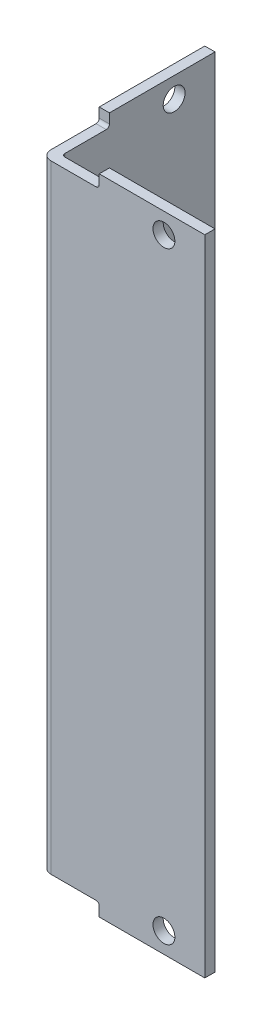
ISO-10303-21;
HEADER;
FILE_DESCRIPTION(('STEP AP214'),'2;1');
FILE_NAME('part.step','',(''),(''),'','','');
FILE_SCHEMA(('AUTOMOTIVE_DESIGN { 1 0 10303 214 1 1 1 1 }'));
ENDSEC;
DATA;
#1=APPLICATION_CONTEXT('core data for automotive mechanical design processes');
#2=APPLICATION_PROTOCOL_DEFINITION('international standard','automotive_design',2000,#1);
#3=PRODUCT_CONTEXT('',#1,'mechanical');
#4=PRODUCT('Part','Part','',(#3));
#5=PRODUCT_RELATED_PRODUCT_CATEGORY('part','',(#4));
#6=PRODUCT_DEFINITION_FORMATION('','',#4);
#7=PRODUCT_DEFINITION_CONTEXT('part definition',#1,'design');
#8=PRODUCT_DEFINITION('design','',#6,#7);
#9=PRODUCT_DEFINITION_SHAPE('','',#8);
#10=(LENGTH_UNIT() NAMED_UNIT(*) SI_UNIT(.MILLI.,.METRE.));
#11=(NAMED_UNIT(*) PLANE_ANGLE_UNIT() SI_UNIT($,.RADIAN.));
#12=(NAMED_UNIT(*) SI_UNIT($,.STERADIAN.) SOLID_ANGLE_UNIT());
#13=UNCERTAINTY_MEASURE_WITH_UNIT(LENGTH_MEASURE(1.E-05),#10,'distance_accuracy_value','');
#14=(GEOMETRIC_REPRESENTATION_CONTEXT(3) GLOBAL_UNCERTAINTY_ASSIGNED_CONTEXT((#13)) GLOBAL_UNIT_ASSIGNED_CONTEXT((#10,
#11,#12)) REPRESENTATION_CONTEXT('',''));
#15=CARTESIAN_POINT('',(0.,0.,0.));
#16=DIRECTION('',(0.,0.,1.));
#17=DIRECTION('',(1.,0.,0.));
#18=AXIS2_PLACEMENT_3D('',#15,#16,#17);
#19=CARTESIAN_POINT('',(-10.6045,-56.75,10.6045));
#20=DIRECTION('',(0.,-1.,0.));
#21=DIRECTION('',(0.,0.,-1.));
#22=AXIS2_PLACEMENT_3D('',#19,#20,#21);
#23=CYLINDRICAL_SURFACE('',#22,0.508);
#24=CARTESIAN_POINT('',(-10.6045,48.250000046,10.6045));
#25=DIRECTION('',(0.,1.,0.));
#26=DIRECTION('',(0.,0.,1.));
#27=AXIS2_PLACEMENT_3D('',#24,#25,#26);
#28=CIRCLE('',#27,0.508);
#29=CARTESIAN_POINT('',(-10.6045,48.250000046,11.1125));
#30=VERTEX_POINT('',#29);
#31=CARTESIAN_POINT('',(-11.1125,48.250000046,10.6045));
#32=VERTEX_POINT('',#31);
#33=EDGE_CURVE('E499',#30,#32,#28,.F.);
#34=ORIENTED_EDGE('',*,*,#33,.F.);
#35=DIRECTION('',(0.,1.,0.));
#36=VECTOR('',#35,1.);
#37=CARTESIAN_POINT('',(-10.6045,56.75,11.1125));
#38=LINE('',#37,#36);
#39=CARTESIAN_POINT('',(-10.6045,-47.75,11.1125));
#40=VERTEX_POINT('',#39);
#41=EDGE_CURVE('E350',#40,#30,#38,.T.);
#42=ORIENTED_EDGE('',*,*,#41,.F.);
#43=CARTESIAN_POINT('',(-10.6045,-47.75,10.6045));
#44=DIRECTION('',(0.,-1.,0.));
#45=DIRECTION('',(0.,0.,-1.));
#46=AXIS2_PLACEMENT_3D('',#43,#44,#45);
#47=CIRCLE('',#46,0.508);
#48=CARTESIAN_POINT('',(-11.1125,-47.75,10.6045));
#49=VERTEX_POINT('',#48);
#50=EDGE_CURVE('E535',#49,#40,#47,.F.);
#51=ORIENTED_EDGE('',*,*,#50,.F.);
#52=DIRECTION('',(0.,1.,0.));
#53=VECTOR('',#52,1.);
#54=CARTESIAN_POINT('',(-11.1125,-56.75,10.6045));
#55=LINE('',#54,#53);
#56=EDGE_CURVE('E354',#32,#49,#55,.F.);
#57=ORIENTED_EDGE('',*,*,#56,.F.);
#58=EDGE_LOOP('',(#34,#42,#51,#57));
#59=FACE_BOUND('',#58,.T.);
#60=ADVANCED_FACE('F44',(#59),#23,.F.);
#61=CARTESIAN_POINT('',(-11.2,56.75,11.2));
#62=DIRECTION('',(0.,-1.,0.));
#63=DIRECTION('',(0.,0.,-1.));
#64=AXIS2_PLACEMENT_3D('',#61,#62,#63);
#65=CYLINDRICAL_SURFACE('',#64,1.5);
#66=DIRECTION('',(0.,-1.,0.));
#67=VECTOR('',#66,1.);
#68=CARTESIAN_POINT('',(-11.2,56.75,12.7));
#69=LINE('',#68,#67);
#70=CARTESIAN_POINT('',(-11.2,48.250000046,12.7));
#71=VERTEX_POINT('',#70);
#72=CARTESIAN_POINT('',(-11.2,-47.75,12.7));
#73=VERTEX_POINT('',#72);
#74=EDGE_CURVE('E357',#71,#73,#69,.T.);
#75=ORIENTED_EDGE('',*,*,#74,.F.);
#76=CARTESIAN_POINT('',(-11.2,48.250000046,11.2));
#77=DIRECTION('',(0.,1.,0.));
#78=DIRECTION('',(0.,0.,1.));
#79=AXIS2_PLACEMENT_3D('',#76,#77,#78);
#80=CIRCLE('',#79,1.5);
#81=CARTESIAN_POINT('',(-12.7,48.250000046,11.2));
#82=VERTEX_POINT('',#81);
#83=EDGE_CURVE('E487',#71,#82,#80,.F.);
#84=ORIENTED_EDGE('',*,*,#83,.T.);
#85=DIRECTION('',(0.,-1.,0.));
#86=VECTOR('',#85,1.);
#87=CARTESIAN_POINT('',(-12.7,56.75,11.2));
#88=LINE('',#87,#86);
#89=CARTESIAN_POINT('',(-12.7,-47.75,11.2));
#90=VERTEX_POINT('',#89);
#91=EDGE_CURVE('E363',#90,#82,#88,.F.);
#92=ORIENTED_EDGE('',*,*,#91,.F.);
#93=CARTESIAN_POINT('',(-11.2,-47.75,11.2));
#94=DIRECTION('',(0.,-1.,0.));
#95=DIRECTION('',(0.,0.,-1.));
#96=AXIS2_PLACEMENT_3D('',#93,#94,#95);
#97=CIRCLE('',#96,1.5);
#98=EDGE_CURVE('E423',#90,#73,#97,.F.);
#99=ORIENTED_EDGE('',*,*,#98,.T.);
#100=EDGE_LOOP('',(#75,#84,#92,#99));
#101=FACE_BOUND('',#100,.T.);
#102=ADVANCED_FACE('F621',(#101),#65,.T.);
#103=CARTESIAN_POINT('',(-12.7,56.75,12.7));
#104=DIRECTION('',(1.,0.,0.));
#105=DIRECTION('',(0.,0.,-1.));
#106=AXIS2_PLACEMENT_3D('',#103,#104,#105);
#107=PLANE('',#106);
#108=CARTESIAN_POINT('',(-12.7,-46.575,-6.35));
#109=DIRECTION('',(-1.,0.,0.));
#110=DIRECTION('',(0.,0.,1.));
#111=AXIS2_PLACEMENT_3D('',#108,#109,#110);
#112=CIRCLE('',#111,1.69999999999999);
#113=CARTESIAN_POINT('',(-12.7,-46.575,-4.65));
#114=VERTEX_POINT('',#113);
#115=EDGE_CURVE('E301',#114,#114,#112,.T.);
#116=ORIENTED_EDGE('',*,*,#115,.F.);
#117=EDGE_LOOP('',(#116));
#118=FACE_BOUND('',#117,.T.);
#119=CARTESIAN_POINT('',(-12.7,47.075,-6.35));
#120=DIRECTION('',(-1.,0.,0.));
#121=DIRECTION('',(0.,0.,1.));
#122=AXIS2_PLACEMENT_3D('',#119,#120,#121);
#123=CIRCLE('',#122,1.69999999999999);
#124=CARTESIAN_POINT('',(-12.7,47.075,-4.65));
#125=VERTEX_POINT('',#124);
#126=EDGE_CURVE('E321',#125,#125,#123,.T.);
#127=ORIENTED_EDGE('',*,*,#126,.F.);
#128=EDGE_LOOP('',(#127));
#129=FACE_BOUND('',#128,.T.);
#130=DIRECTION('',(0.,0.,1.));
#131=VECTOR('',#130,1.);
#132=CARTESIAN_POINT('',(-12.7,-33.749999954,9.1125));
#133=LINE('',#132,#131);
#134=CARTESIAN_POINT('',(-12.7,-33.749999954,4.2));
#135=VERTEX_POINT('',#134);
#136=CARTESIAN_POINT('',(-12.7,-33.749999954,7.525));
#137=VERTEX_POINT('',#136);
#138=EDGE_CURVE('E546',#135,#137,#133,.T.);
#139=ORIENTED_EDGE('',*,*,#138,.T.);
#140=CARTESIAN_POINT('',(-12.7,-35.337499954,7.525));
#141=DIRECTION('',(1.,0.,0.));
#142=DIRECTION('',(0.,0.,-1.));
#143=AXIS2_PLACEMENT_3D('',#140,#141,#142);
#144=CIRCLE('',#143,1.5875);
#145=CARTESIAN_POINT('',(-12.7,-35.337499954,9.1125));
#146=VERTEX_POINT('',#145);
#147=EDGE_CURVE('E416',#137,#146,#144,.T.);
#148=ORIENTED_EDGE('',*,*,#147,.T.);
#149=DIRECTION('',(0.,-1.,0.));
#150=VECTOR('',#149,1.);
#151=CARTESIAN_POINT('',(-12.7,-40.749999954,9.1125));
#152=LINE('',#151,#150);
#153=CARTESIAN_POINT('',(-12.7,-39.162499954,9.1125));
#154=VERTEX_POINT('',#153);
#155=EDGE_CURVE('E550',#146,#154,#152,.T.);
#156=ORIENTED_EDGE('',*,*,#155,.T.);
#157=CARTESIAN_POINT('',(-12.7,-39.162499954,7.525));
#158=DIRECTION('',(1.,0.,0.));
#159=DIRECTION('',(0.,0.,-1.));
#160=AXIS2_PLACEMENT_3D('',#157,#158,#159);
#161=CIRCLE('',#160,1.5875);
#162=CARTESIAN_POINT('',(-12.7,-40.749999954,7.525));
#163=VERTEX_POINT('',#162);
#164=EDGE_CURVE('E410',#154,#163,#161,.T.);
#165=ORIENTED_EDGE('',*,*,#164,.T.);
#166=DIRECTION('',(0.,0.,1.));
#167=VECTOR('',#166,1.);
#168=CARTESIAN_POINT('',(-12.7,-40.749999954,9.1125));
#169=LINE('',#168,#167);
#170=CARTESIAN_POINT('',(-12.7,-40.749999954,4.2));
#171=VERTEX_POINT('',#170);
#172=EDGE_CURVE('E554',#171,#163,#169,.T.);
#173=ORIENTED_EDGE('',*,*,#172,.F.);
#174=CARTESIAN_POINT('',(-12.7,-39.162499954,4.2));
#175=DIRECTION('',(1.,0.,0.));
#176=DIRECTION('',(0.,0.,-1.));
#177=AXIS2_PLACEMENT_3D('',#174,#175,#176);
#178=CIRCLE('',#177,1.5875);
#179=CARTESIAN_POINT('',(-12.7,-39.162499954,2.6125));
#180=VERTEX_POINT('',#179);
#181=EDGE_CURVE('E404',#171,#180,#178,.T.);
#182=ORIENTED_EDGE('',*,*,#181,.T.);
#183=DIRECTION('',(0.,-1.,0.));
#184=VECTOR('',#183,1.);
#185=CARTESIAN_POINT('',(-12.7,-40.749999954,2.6125));
#186=LINE('',#185,#184);
#187=CARTESIAN_POINT('',(-12.7,-35.337499954,2.6125));
#188=VERTEX_POINT('',#187);
#189=EDGE_CURVE('E574',#188,#180,#186,.T.);
#190=ORIENTED_EDGE('',*,*,#189,.F.);
#191=CARTESIAN_POINT('',(-12.7,-35.337499954,4.2));
#192=DIRECTION('',(1.,0.,0.));
#193=DIRECTION('',(0.,0.,-1.));
#194=AXIS2_PLACEMENT_3D('',#191,#192,#193);
#195=CIRCLE('',#194,1.5875);
#196=EDGE_CURVE('E398',#188,#135,#195,.T.);
#197=ORIENTED_EDGE('',*,*,#196,.T.);
#198=EDGE_LOOP('',(#139,#148,#156,#165,#173,#182,#190,#197));
#199=FACE_BOUND('',#198,.T.);
#200=DIRECTION('',(0.,0.,-1.));
#201=VECTOR('',#200,1.);
#202=CARTESIAN_POINT('',(-12.7,48.250000046,12.7));
#203=LINE('',#202,#201);
#204=CARTESIAN_POINT('',(-12.7,48.250000046,4.2));
#205=VERTEX_POINT('',#204);
#206=EDGE_CURVE('E280',#82,#205,#203,.T.);
#207=ORIENTED_EDGE('',*,*,#206,.T.);
#208=CARTESIAN_POINT('',(-12.7,48.750000046,4.2));
#209=DIRECTION('',(1.,0.,0.));
#210=DIRECTION('',(0.,0.,-1.));
#211=AXIS2_PLACEMENT_3D('',#208,#209,#210);
#212=CIRCLE('',#211,0.5);
#213=CARTESIAN_POINT('',(-12.7,48.750000046,3.7));
#214=VERTEX_POINT('',#213);
#215=EDGE_CURVE('E264',#205,#214,#212,.T.);
#216=ORIENTED_EDGE('',*,*,#215,.T.);
#217=DIRECTION('',(0.,1.,0.));
#218=VECTOR('',#217,1.);
#219=CARTESIAN_POINT('',(-12.7,48.250000046,3.7));
#220=LINE('',#219,#218);
#221=CARTESIAN_POINT('',(-12.7,50.250000046,3.7));
#222=VERTEX_POINT('',#221);
#223=EDGE_CURVE('E255',#214,#222,#220,.T.);
#224=ORIENTED_EDGE('',*,*,#223,.T.);
#225=DIRECTION('',(0.,0.,1.));
#226=VECTOR('',#225,1.);
#227=CARTESIAN_POINT('',(-12.7,50.250000046,-12.7));
#228=LINE('',#227,#226);
#229=CARTESIAN_POINT('',(-12.7,50.250000046,-12.7));
#230=VERTEX_POINT('',#229);
#231=EDGE_CURVE('E261',#230,#222,#228,.T.);
#232=ORIENTED_EDGE('',*,*,#231,.F.);
#233=DIRECTION('',(0.,-1.,0.));
#234=VECTOR('',#233,1.);
#235=CARTESIAN_POINT('',(-12.7,56.75,-12.7));
#236=LINE('',#235,#234);
#237=CARTESIAN_POINT('',(-12.7,-49.75,-12.7));
#238=VERTEX_POINT('',#237);
#239=EDGE_CURVE('E347',#230,#238,#236,.T.);
#240=ORIENTED_EDGE('',*,*,#239,.T.);
#241=DIRECTION('',(0.,0.,-1.));
#242=VECTOR('',#241,1.);
#243=CARTESIAN_POINT('',(-12.7,-49.75,-12.7));
#244=LINE('',#243,#242);
#245=CARTESIAN_POINT('',(-12.7,-49.75,3.7));
#246=VERTEX_POINT('',#245);
#247=EDGE_CURVE('E293',#246,#238,#244,.T.);
#248=ORIENTED_EDGE('',*,*,#247,.F.);
#249=DIRECTION('',(0.,-1.,0.));
#250=VECTOR('',#249,1.);
#251=CARTESIAN_POINT('',(-12.7,-47.75,3.7));
#252=LINE('',#251,#250);
#253=CARTESIAN_POINT('',(-12.7,-48.25,3.7));
#254=VERTEX_POINT('',#253);
#255=EDGE_CURVE('E519',#254,#246,#252,.T.);
#256=ORIENTED_EDGE('',*,*,#255,.F.);
#257=CARTESIAN_POINT('',(-12.7,-48.25,4.2));
#258=DIRECTION('',(1.,0.,0.));
#259=DIRECTION('',(0.,0.,-1.));
#260=AXIS2_PLACEMENT_3D('',#257,#258,#259);
#261=CIRCLE('',#260,0.5);
#262=CARTESIAN_POINT('',(-12.7,-47.75,4.2));
#263=VERTEX_POINT('',#262);
#264=EDGE_CURVE('E444',#254,#263,#261,.T.);
#265=ORIENTED_EDGE('',*,*,#264,.T.);
#266=DIRECTION('',(0.,0.,-1.));
#267=VECTOR('',#266,1.);
#268=CARTESIAN_POINT('',(-12.7,-47.75,12.7));
#269=LINE('',#268,#267);
#270=EDGE_CURVE('E511',#90,#263,#269,.T.);
#271=ORIENTED_EDGE('',*,*,#270,.F.);
#272=ORIENTED_EDGE('',*,*,#91,.T.);
#273=EDGE_LOOP('',(#207,#216,#224,#232,#240,#248,#256,#265,#271,#272));
#274=FACE_BOUND('',#273,.T.);
#275=ADVANCED_FACE('F258',(#118,#129,#199,#274),#107,.F.);
#276=CARTESIAN_POINT('',(-11.1125,-56.75,-12.7));
#277=DIRECTION('',(-1.,0.,0.));
#278=DIRECTION('',(0.,0.,1.));
#279=AXIS2_PLACEMENT_3D('',#276,#277,#278);
#280=PLANE('',#279);
#281=CARTESIAN_POINT('',(-11.1125,-46.575,-6.35));
#282=DIRECTION('',(-1.,0.,0.));
#283=DIRECTION('',(0.,0.,1.));
#284=AXIS2_PLACEMENT_3D('',#281,#282,#283);
#285=CIRCLE('',#284,1.69999999999999);
#286=CARTESIAN_POINT('',(-11.1125,-46.575,-4.65));
#287=VERTEX_POINT('',#286);
#288=EDGE_CURVE('E312',#287,#287,#285,.T.);
#289=ORIENTED_EDGE('',*,*,#288,.T.);
#290=EDGE_LOOP('',(#289));
#291=FACE_BOUND('',#290,.T.);
#292=CARTESIAN_POINT('',(-11.1125,47.075,-6.35));
#293=DIRECTION('',(-1.,0.,0.));
#294=DIRECTION('',(0.,0.,1.));
#295=AXIS2_PLACEMENT_3D('',#292,#293,#294);
#296=CIRCLE('',#295,1.69999999999999);
#297=CARTESIAN_POINT('',(-11.1125,47.075,-4.65));
#298=VERTEX_POINT('',#297);
#299=EDGE_CURVE('E325',#298,#298,#296,.T.);
#300=ORIENTED_EDGE('',*,*,#299,.T.);
#301=EDGE_LOOP('',(#300));
#302=FACE_BOUND('',#301,.T.);
#303=DIRECTION('',(0.,1.,0.));
#304=VECTOR('',#303,1.);
#305=CARTESIAN_POINT('',(-11.1125,-40.749999954,2.6125));
#306=LINE('',#305,#304);
#307=CARTESIAN_POINT('',(-11.1125,-39.162499954,2.6125));
#308=VERTEX_POINT('',#307);
#309=CARTESIAN_POINT('',(-11.1125,-35.337499954,2.6125));
#310=VERTEX_POINT('',#309);
#311=EDGE_CURVE('E570',#308,#310,#306,.T.);
#312=ORIENTED_EDGE('',*,*,#311,.F.);
#313=CARTESIAN_POINT('',(-11.1125,-39.162499954,4.2));
#314=DIRECTION('',(-1.,0.,0.));
#315=DIRECTION('',(0.,0.,1.));
#316=AXIS2_PLACEMENT_3D('',#313,#314,#315);
#317=CIRCLE('',#316,1.5875);
#318=CARTESIAN_POINT('',(-11.1125,-40.749999954,4.2));
#319=VERTEX_POINT('',#318);
#320=EDGE_CURVE('E401',#308,#319,#317,.T.);
#321=ORIENTED_EDGE('',*,*,#320,.T.);
#322=DIRECTION('',(0.,0.,-1.));
#323=VECTOR('',#322,1.);
#324=CARTESIAN_POINT('',(-11.1125,-40.749999954,9.1125));
#325=LINE('',#324,#323);
#326=CARTESIAN_POINT('',(-11.1125,-40.749999954,7.525));
#327=VERTEX_POINT('',#326);
#328=EDGE_CURVE('E558',#327,#319,#325,.T.);
#329=ORIENTED_EDGE('',*,*,#328,.F.);
#330=CARTESIAN_POINT('',(-11.1125,-39.162499954,7.525));
#331=DIRECTION('',(-1.,0.,0.));
#332=DIRECTION('',(0.,0.,1.));
#333=AXIS2_PLACEMENT_3D('',#330,#331,#332);
#334=CIRCLE('',#333,1.5875);
#335=CARTESIAN_POINT('',(-11.1125,-39.162499954,9.1125));
#336=VERTEX_POINT('',#335);
#337=EDGE_CURVE('E407',#327,#336,#334,.T.);
#338=ORIENTED_EDGE('',*,*,#337,.T.);
#339=DIRECTION('',(0.,1.,0.));
#340=VECTOR('',#339,1.);
#341=CARTESIAN_POINT('',(-11.1125,-40.749999954,9.1125));
#342=LINE('',#341,#340);
#343=CARTESIAN_POINT('',(-11.1125,-35.337499954,9.1125));
#344=VERTEX_POINT('',#343);
#345=EDGE_CURVE('E562',#336,#344,#342,.T.);
#346=ORIENTED_EDGE('',*,*,#345,.T.);
#347=CARTESIAN_POINT('',(-11.1125,-35.337499954,7.525));
#348=DIRECTION('',(-1.,0.,0.));
#349=DIRECTION('',(0.,0.,1.));
#350=AXIS2_PLACEMENT_3D('',#347,#348,#349);
#351=CIRCLE('',#350,1.5875);
#352=CARTESIAN_POINT('',(-11.1125,-33.749999954,7.525));
#353=VERTEX_POINT('',#352);
#354=EDGE_CURVE('E413',#344,#353,#351,.T.);
#355=ORIENTED_EDGE('',*,*,#354,.T.);
#356=DIRECTION('',(0.,0.,-1.));
#357=VECTOR('',#356,1.);
#358=CARTESIAN_POINT('',(-11.1125,-33.749999954,9.1125));
#359=LINE('',#358,#357);
#360=CARTESIAN_POINT('',(-11.1125,-33.749999954,4.2));
#361=VERTEX_POINT('',#360);
#362=EDGE_CURVE('E566',#353,#361,#359,.T.);
#363=ORIENTED_EDGE('',*,*,#362,.T.);
#364=CARTESIAN_POINT('',(-11.1125,-35.337499954,4.2));
#365=DIRECTION('',(-1.,0.,0.));
#366=DIRECTION('',(0.,0.,1.));
#367=AXIS2_PLACEMENT_3D('',#364,#365,#366);
#368=CIRCLE('',#367,1.5875);
#369=EDGE_CURVE('E395',#361,#310,#368,.T.);
#370=ORIENTED_EDGE('',*,*,#369,.T.);
#371=EDGE_LOOP('',(#312,#321,#329,#338,#346,#355,#363,#370));
#372=FACE_BOUND('',#371,.T.);
#373=DIRECTION('',(0.,1.,0.));
#374=VECTOR('',#373,1.);
#375=CARTESIAN_POINT('',(-11.1125,-56.75,3.7));
#376=LINE('',#375,#374);
#377=CARTESIAN_POINT('',(-11.1125,48.750000046,3.7));
#378=VERTEX_POINT('',#377);
#379=CARTESIAN_POINT('',(-11.1125,50.250000046,3.7));
#380=VERTEX_POINT('',#379);
#381=EDGE_CURVE('E276',#378,#380,#376,.T.);
#382=ORIENTED_EDGE('',*,*,#381,.F.);
#383=CARTESIAN_POINT('',(-11.1125,48.750000046,4.2));
#384=DIRECTION('',(-1.,0.,0.));
#385=DIRECTION('',(0.,0.,1.));
#386=AXIS2_PLACEMENT_3D('',#383,#384,#385);
#387=CIRCLE('',#386,0.5);
#388=CARTESIAN_POINT('',(-11.1125,48.250000046,4.2));
#389=VERTEX_POINT('',#388);
#390=EDGE_CURVE('E471',#378,#389,#387,.T.);
#391=ORIENTED_EDGE('',*,*,#390,.T.);
#392=DIRECTION('',(0.,0.,-1.));
#393=VECTOR('',#392,1.);
#394=CARTESIAN_POINT('',(-11.1125,48.250000046,-12.7));
#395=LINE('',#394,#393);
#396=EDGE_CURVE('E505',#32,#389,#395,.T.);
#397=ORIENTED_EDGE('',*,*,#396,.F.);
#398=ORIENTED_EDGE('',*,*,#56,.T.);
#399=DIRECTION('',(0.,0.,1.));
#400=VECTOR('',#399,1.);
#401=CARTESIAN_POINT('',(-11.1125,-47.75,-12.7));
#402=LINE('',#401,#400);
#403=CARTESIAN_POINT('',(-11.1125,-47.75,4.2));
#404=VERTEX_POINT('',#403);
#405=EDGE_CURVE('E542',#404,#49,#402,.T.);
#406=ORIENTED_EDGE('',*,*,#405,.F.);
#407=CARTESIAN_POINT('',(-11.1125,-48.25,4.2));
#408=DIRECTION('',(-1.,0.,0.));
#409=DIRECTION('',(0.,0.,1.));
#410=AXIS2_PLACEMENT_3D('',#407,#408,#409);
#411=CIRCLE('',#410,0.5);
#412=CARTESIAN_POINT('',(-11.1125,-48.25,3.7));
#413=VERTEX_POINT('',#412);
#414=EDGE_CURVE('E441',#404,#413,#411,.T.);
#415=ORIENTED_EDGE('',*,*,#414,.T.);
#416=DIRECTION('',(0.,-1.,0.));
#417=VECTOR('',#416,1.);
#418=CARTESIAN_POINT('',(-11.1125,-56.75,3.7));
#419=LINE('',#418,#417);
#420=CARTESIAN_POINT('',(-11.1125,-49.75,3.7));
#421=VERTEX_POINT('',#420);
#422=EDGE_CURVE('E526',#413,#421,#419,.T.);
#423=ORIENTED_EDGE('',*,*,#422,.T.);
#424=DIRECTION('',(0.,0.,1.));
#425=VECTOR('',#424,1.);
#426=CARTESIAN_POINT('',(-11.1125,-49.75,-12.7));
#427=LINE('',#426,#425);
#428=CARTESIAN_POINT('',(-11.1125,-49.75,-12.7));
#429=VERTEX_POINT('',#428);
#430=EDGE_CURVE('E302',#429,#421,#427,.T.);
#431=ORIENTED_EDGE('',*,*,#430,.F.);
#432=DIRECTION('',(0.,1.,0.));
#433=VECTOR('',#432,1.);
#434=CARTESIAN_POINT('',(-11.1125,-56.75,-12.7));
#435=LINE('',#434,#433);
#436=CARTESIAN_POINT('',(-11.1125,50.250000046,-12.7));
#437=VERTEX_POINT('',#436);
#438=EDGE_CURVE('E337',#429,#437,#435,.T.);
#439=ORIENTED_EDGE('',*,*,#438,.T.);
#440=DIRECTION('',(0.,0.,-1.));
#441=VECTOR('',#440,1.);
#442=CARTESIAN_POINT('',(-11.1125,50.250000046,-12.7));
#443=LINE('',#442,#441);
#444=EDGE_CURVE('E290',#380,#437,#443,.T.);
#445=ORIENTED_EDGE('',*,*,#444,.F.);
#446=EDGE_LOOP('',(#382,#391,#397,#398,#406,#415,#423,#431,#439,#445));
#447=FACE_BOUND('',#446,.T.);
#448=ADVANCED_FACE('F634',(#291,#302,#372,#447),#280,.F.);
#449=CARTESIAN_POINT('',(-12.7,56.75,12.7));
#450=DIRECTION('',(0.,0.,-1.));
#451=DIRECTION('',(-1.,0.,0.));
#452=AXIS2_PLACEMENT_3D('',#449,#450,#451);
#453=PLANE('',#452);
#454=CARTESIAN_POINT('',(6.34999999999999,47.075,12.7));
#455=DIRECTION('',(0.,0.,1.));
#456=DIRECTION('',(1.,0.,0.));
#457=AXIS2_PLACEMENT_3D('',#454,#455,#456);
#458=CIRCLE('',#457,1.7);
#459=CARTESIAN_POINT('',(8.04999999999999,47.075,12.7));
#460=VERTEX_POINT('',#459);
#461=EDGE_CURVE('E329',#460,#460,#458,.T.);
#462=ORIENTED_EDGE('',*,*,#461,.F.);
#463=EDGE_LOOP('',(#462));
#464=FACE_BOUND('',#463,.T.);
#465=CARTESIAN_POINT('',(6.34999999999999,-46.575,12.7));
#466=DIRECTION('',(0.,0.,1.));
#467=DIRECTION('',(1.,0.,0.));
#468=AXIS2_PLACEMENT_3D('',#465,#466,#467);
#469=CIRCLE('',#468,1.7);
#470=CARTESIAN_POINT('',(8.04999999999999,-46.575,12.7));
#471=VERTEX_POINT('',#470);
#472=EDGE_CURVE('E313',#471,#471,#469,.T.);
#473=ORIENTED_EDGE('',*,*,#472,.F.);
#474=EDGE_LOOP('',(#473));
#475=FACE_BOUND('',#474,.T.);
#476=DIRECTION('',(0.,1.,0.));
#477=VECTOR('',#476,1.);
#478=CARTESIAN_POINT('',(-3.7,48.250000046,12.7));
#479=LINE('',#478,#477);
#480=CARTESIAN_POINT('',(-3.7,48.750000046,12.7));
#481=VERTEX_POINT('',#480);
#482=CARTESIAN_POINT('',(-3.70000000000001,50.25,12.7));
#483=VERTEX_POINT('',#482);
#484=EDGE_CURVE('E270',#481,#483,#479,.T.);
#485=ORIENTED_EDGE('',*,*,#484,.F.);
#486=CARTESIAN_POINT('',(-4.2,48.750000046,12.7));
#487=DIRECTION('',(0.,0.,-1.));
#488=DIRECTION('',(-1.,0.,0.));
#489=AXIS2_PLACEMENT_3D('',#486,#487,#488);
#490=CIRCLE('',#489,0.5);
#491=CARTESIAN_POINT('',(-4.2,48.250000046,12.7));
#492=VERTEX_POINT('',#491);
#493=EDGE_CURVE('E53',#481,#492,#490,.T.);
#494=ORIENTED_EDGE('',*,*,#493,.T.);
#495=DIRECTION('',(-1.,0.,0.));
#496=VECTOR('',#495,1.);
#497=CARTESIAN_POINT('',(-12.7,48.250000046,12.7));
#498=LINE('',#497,#496);
#499=EDGE_CURVE('E480',#492,#71,#498,.T.);
#500=ORIENTED_EDGE('',*,*,#499,.T.);
#501=ORIENTED_EDGE('',*,*,#74,.T.);
#502=DIRECTION('',(-1.,0.,0.));
#503=VECTOR('',#502,1.);
#504=CARTESIAN_POINT('',(-12.7,-47.75,12.7));
#505=LINE('',#504,#503);
#506=CARTESIAN_POINT('',(-4.2,-47.75,12.7));
#507=VERTEX_POINT('',#506);
#508=EDGE_CURVE('E515',#507,#73,#505,.T.);
#509=ORIENTED_EDGE('',*,*,#508,.F.);
#510=CARTESIAN_POINT('',(-4.2,-48.25,12.7));
#511=DIRECTION('',(0.,0.,-1.));
#512=DIRECTION('',(-1.,0.,0.));
#513=AXIS2_PLACEMENT_3D('',#510,#511,#512);
#514=CIRCLE('',#513,0.5);
#515=CARTESIAN_POINT('',(-3.7,-48.25,12.7));
#516=VERTEX_POINT('',#515);
#517=EDGE_CURVE('E447',#507,#516,#514,.T.);
#518=ORIENTED_EDGE('',*,*,#517,.T.);
#519=DIRECTION('',(0.,-1.,0.));
#520=VECTOR('',#519,1.);
#521=CARTESIAN_POINT('',(-3.7,-47.75,12.7));
#522=LINE('',#521,#520);
#523=CARTESIAN_POINT('',(-3.7,-49.75,12.7));
#524=VERTEX_POINT('',#523);
#525=EDGE_CURVE('E523',#516,#524,#522,.T.);
#526=ORIENTED_EDGE('',*,*,#525,.T.);
#527=DIRECTION('',(-1.,0.,0.));
#528=VECTOR('',#527,1.);
#529=CARTESIAN_POINT('',(12.7,-49.75,12.7));
#530=LINE('',#529,#528);
#531=CARTESIAN_POINT('',(12.7,-49.75,12.7));
#532=VERTEX_POINT('',#531);
#533=EDGE_CURVE('E578',#532,#524,#530,.T.);
#534=ORIENTED_EDGE('',*,*,#533,.F.);
#535=DIRECTION('',(0.,-1.,0.));
#536=VECTOR('',#535,1.);
#537=CARTESIAN_POINT('',(12.7,56.75,12.7));
#538=LINE('',#537,#536);
#539=CARTESIAN_POINT('',(12.7,50.25,12.7));
#540=VERTEX_POINT('',#539);
#541=EDGE_CURVE('E341',#540,#532,#538,.T.);
#542=ORIENTED_EDGE('',*,*,#541,.F.);
#543=DIRECTION('',(1.,0.,0.));
#544=VECTOR('',#543,1.);
#545=CARTESIAN_POINT('',(12.7,50.25,12.7));
#546=LINE('',#545,#544);
#547=EDGE_CURVE('E582',#483,#540,#546,.T.);
#548=ORIENTED_EDGE('',*,*,#547,.F.);
#549=EDGE_LOOP('',(#485,#494,#500,#501,#509,#518,#526,#534,#542,#548));
#550=FACE_BOUND('',#549,.T.);
#551=ADVANCED_FACE('F479',(#464,#475,#550),#453,.F.);
#552=CARTESIAN_POINT('',(12.7,-56.75,11.1125));
#553=DIRECTION('',(0.,0.,1.));
#554=DIRECTION('',(1.,0.,0.));
#555=AXIS2_PLACEMENT_3D('',#552,#553,#554);
#556=PLANE('',#555);
#557=CARTESIAN_POINT('',(6.34999999999999,47.075,11.1125));
#558=DIRECTION('',(0.,0.,1.));
#559=DIRECTION('',(1.,0.,0.));
#560=AXIS2_PLACEMENT_3D('',#557,#558,#559);
#561=CIRCLE('',#560,1.69999999999999);
#562=CARTESIAN_POINT('',(8.04999999999999,47.075,11.1125));
#563=VERTEX_POINT('',#562);
#564=EDGE_CURVE('E333',#563,#563,#561,.T.);
#565=ORIENTED_EDGE('',*,*,#564,.T.);
#566=EDGE_LOOP('',(#565));
#567=FACE_BOUND('',#566,.T.);
#568=CARTESIAN_POINT('',(6.34999999999999,-46.575,11.1125));
#569=DIRECTION('',(0.,0.,1.));
#570=DIRECTION('',(1.,0.,0.));
#571=AXIS2_PLACEMENT_3D('',#568,#569,#570);
#572=CIRCLE('',#571,1.69999999999999);
#573=CARTESIAN_POINT('',(8.04999999999999,-46.575,11.1125));
#574=VERTEX_POINT('',#573);
#575=EDGE_CURVE('E317',#574,#574,#572,.T.);
#576=ORIENTED_EDGE('',*,*,#575,.T.);
#577=EDGE_LOOP('',(#576));
#578=FACE_BOUND('',#577,.T.);
#579=DIRECTION('',(0.,-1.,0.));
#580=VECTOR('',#579,1.);
#581=CARTESIAN_POINT('',(-3.70000000000001,-56.75,11.1125));
#582=LINE('',#581,#580);
#583=CARTESIAN_POINT('',(-3.7,50.250000046,11.1125));
#584=VERTEX_POINT('',#583);
#585=CARTESIAN_POINT('',(-3.70000000000001,48.750000046,11.1125));
#586=VERTEX_POINT('',#585);
#587=EDGE_CURVE('E269',#584,#586,#582,.T.);
#588=ORIENTED_EDGE('',*,*,#587,.F.);
#589=DIRECTION('',(-1.,0.,0.));
#590=VECTOR('',#589,1.);
#591=CARTESIAN_POINT('',(12.7,50.25,11.1125));
#592=LINE('',#591,#590);
#593=CARTESIAN_POINT('',(12.7,50.25,11.1125));
#594=VERTEX_POINT('',#593);
#595=EDGE_CURVE('E579',#594,#584,#592,.T.);
#596=ORIENTED_EDGE('',*,*,#595,.F.);
#597=DIRECTION('',(0.,1.,0.));
#598=VECTOR('',#597,1.);
#599=CARTESIAN_POINT('',(12.7,-56.75,11.1125));
#600=LINE('',#599,#598);
#601=CARTESIAN_POINT('',(12.7,-49.75,11.1125));
#602=VERTEX_POINT('',#601);
#603=EDGE_CURVE('E338',#602,#594,#600,.T.);
#604=ORIENTED_EDGE('',*,*,#603,.F.);
#605=DIRECTION('',(1.,0.,0.));
#606=VECTOR('',#605,1.);
#607=CARTESIAN_POINT('',(12.7,-49.75,11.1125));
#608=LINE('',#607,#606);
#609=CARTESIAN_POINT('',(-3.7,-49.75,11.1125));
#610=VERTEX_POINT('',#609);
#611=EDGE_CURVE('E296',#610,#602,#608,.T.);
#612=ORIENTED_EDGE('',*,*,#611,.F.);
#613=DIRECTION('',(0.,1.,0.));
#614=VECTOR('',#613,1.);
#615=CARTESIAN_POINT('',(-3.70000000000001,-56.75,11.1125));
#616=LINE('',#615,#614);
#617=CARTESIAN_POINT('',(-3.70000000000001,-48.25,11.1125));
#618=VERTEX_POINT('',#617);
#619=EDGE_CURVE('E531',#610,#618,#616,.T.);
#620=ORIENTED_EDGE('',*,*,#619,.T.);
#621=CARTESIAN_POINT('',(-4.2,-48.25,11.1125));
#622=DIRECTION('',(0.,0.,1.));
#623=DIRECTION('',(1.,0.,0.));
#624=AXIS2_PLACEMENT_3D('',#621,#622,#623);
#625=CIRCLE('',#624,0.5);
#626=CARTESIAN_POINT('',(-4.20000000000001,-47.75,11.1125));
#627=VERTEX_POINT('',#626);
#628=EDGE_CURVE('E450',#618,#627,#625,.T.);
#629=ORIENTED_EDGE('',*,*,#628,.T.);
#630=DIRECTION('',(1.,0.,0.));
#631=VECTOR('',#630,1.);
#632=CARTESIAN_POINT('',(12.7,-47.75,11.1125));
#633=LINE('',#632,#631);
#634=EDGE_CURVE('E538',#40,#627,#633,.T.);
#635=ORIENTED_EDGE('',*,*,#634,.F.);
#636=ORIENTED_EDGE('',*,*,#41,.T.);
#637=DIRECTION('',(-1.,0.,0.));
#638=VECTOR('',#637,1.);
#639=CARTESIAN_POINT('',(12.7,48.250000046,11.1125));
#640=LINE('',#639,#638);
#641=CARTESIAN_POINT('',(-4.20000000000001,48.250000046,11.1125));
#642=VERTEX_POINT('',#641);
#643=EDGE_CURVE('E456',#642,#30,#640,.T.);
#644=ORIENTED_EDGE('',*,*,#643,.F.);
#645=CARTESIAN_POINT('',(-4.2,48.750000046,11.1125));
#646=DIRECTION('',(0.,0.,1.));
#647=DIRECTION('',(1.,0.,0.));
#648=AXIS2_PLACEMENT_3D('',#645,#646,#647);
#649=CIRCLE('',#648,0.5);
#650=EDGE_CURVE('E11',#642,#586,#649,.T.);
#651=ORIENTED_EDGE('',*,*,#650,.T.);
#652=EDGE_LOOP('',(#588,#596,#604,#612,#620,#629,#635,#636,#644,#651));
#653=FACE_BOUND('',#652,.T.);
#654=ADVANCED_FACE('F605',(#567,#578,#653),#556,.F.);
#655=CARTESIAN_POINT('',(12.701,50.250000046,-12.7));
#656=DIRECTION('',(0.,-1.,0.));
#657=DIRECTION('',(0.,0.,-1.));
#658=AXIS2_PLACEMENT_3D('',#655,#656,#657);
#659=PLANE('',#658);
#660=DIRECTION('',(1.,0.,0.));
#661=VECTOR('',#660,1.);
#662=CARTESIAN_POINT('',(-12.7,50.250000046,3.7));
#663=LINE('',#662,#661);
#664=EDGE_CURVE('E273',#222,#380,#663,.T.);
#665=ORIENTED_EDGE('',*,*,#664,.T.);
#666=ORIENTED_EDGE('',*,*,#444,.T.);
#667=DIRECTION('',(-1.,0.,0.));
#668=VECTOR('',#667,1.);
#669=CARTESIAN_POINT('',(12.701,50.250000046,-12.7));
#670=LINE('',#669,#668);
#671=EDGE_CURVE('E284',#437,#230,#670,.T.);
#672=ORIENTED_EDGE('',*,*,#671,.T.);
#673=ORIENTED_EDGE('',*,*,#231,.T.);
#674=EDGE_LOOP('',(#665,#666,#672,#673));
#675=FACE_BOUND('',#674,.T.);
#676=ADVANCED_FACE('F282',(#675),#659,.F.);
#677=DIRECTION('',(0.,0.,-1.));
#678=VECTOR('',#677,1.);
#679=CARTESIAN_POINT('',(-3.7,50.250000046,-12.7));
#680=LINE('',#679,#678);
#681=EDGE_CURVE('E453',#483,#584,#680,.T.);
#682=ORIENTED_EDGE('',*,*,#681,.F.);
#683=ORIENTED_EDGE('',*,*,#547,.T.);
#684=DIRECTION('',(0.,0.,1.));
#685=VECTOR('',#684,1.);
#686=CARTESIAN_POINT('',(12.7,50.25,-12.701));
#687=LINE('',#686,#685);
#688=EDGE_CURVE('E306',#594,#540,#687,.T.);
#689=ORIENTED_EDGE('',*,*,#688,.F.);
#690=ORIENTED_EDGE('',*,*,#595,.T.);
#691=EDGE_LOOP('',(#682,#683,#689,#690));
#692=FACE_BOUND('',#691,.T.);
#693=ADVANCED_FACE('F607',(#692),#659,.F.);
#694=CARTESIAN_POINT('',(12.701,-49.75,-12.7));
#695=DIRECTION('',(0.,1.,0.));
#696=DIRECTION('',(0.,0.,1.));
#697=AXIS2_PLACEMENT_3D('',#694,#695,#696);
#698=PLANE('',#697);
#699=ORIENTED_EDGE('',*,*,#533,.T.);
#700=DIRECTION('',(0.,0.,-1.));
#701=VECTOR('',#700,1.);
#702=CARTESIAN_POINT('',(-3.7,-49.75,-12.7));
#703=LINE('',#702,#701);
#704=EDGE_CURVE('E419',#524,#610,#703,.T.);
#705=ORIENTED_EDGE('',*,*,#704,.T.);
#706=ORIENTED_EDGE('',*,*,#611,.T.);
#707=DIRECTION('',(0.,0.,1.));
#708=VECTOR('',#707,1.);
#709=CARTESIAN_POINT('',(12.7,-49.75,-12.701));
#710=LINE('',#709,#708);
#711=EDGE_CURVE('E590',#602,#532,#710,.T.);
#712=ORIENTED_EDGE('',*,*,#711,.T.);
#713=EDGE_LOOP('',(#699,#705,#706,#712));
#714=FACE_BOUND('',#713,.T.);
#715=ADVANCED_FACE('F598',(#714),#698,.F.);
#716=CARTESIAN_POINT('',(12.7,56.75,12.7));
#717=DIRECTION('',(-1.,0.,0.));
#718=DIRECTION('',(0.,0.,1.));
#719=AXIS2_PLACEMENT_3D('',#716,#717,#718);
#720=PLANE('',#719);
#721=ORIENTED_EDGE('',*,*,#603,.T.);
#722=ORIENTED_EDGE('',*,*,#688,.T.);
#723=ORIENTED_EDGE('',*,*,#541,.T.);
#724=ORIENTED_EDGE('',*,*,#711,.F.);
#725=EDGE_LOOP('',(#721,#722,#723,#724));
#726=FACE_BOUND('',#725,.T.);
#727=ADVANCED_FACE('F602',(#726),#720,.F.);
#728=CARTESIAN_POINT('',(-12.7,56.75,-12.7));
#729=DIRECTION('',(0.,0.,1.));
#730=DIRECTION('',(1.,0.,0.));
#731=AXIS2_PLACEMENT_3D('',#728,#729,#730);
#732=PLANE('',#731);
#733=ORIENTED_EDGE('',*,*,#671,.F.);
#734=ORIENTED_EDGE('',*,*,#438,.F.);
#735=DIRECTION('',(-1.,0.,0.));
#736=VECTOR('',#735,1.);
#737=CARTESIAN_POINT('',(12.701,-49.75,-12.7));
#738=LINE('',#737,#736);
#739=EDGE_CURVE('E286',#429,#238,#738,.T.);
#740=ORIENTED_EDGE('',*,*,#739,.T.);
#741=ORIENTED_EDGE('',*,*,#239,.F.);
#742=EDGE_LOOP('',(#733,#734,#740,#741));
#743=FACE_BOUND('',#742,.T.);
#744=ADVANCED_FACE('F647',(#743),#732,.F.);
#745=CARTESIAN_POINT('',(6.34999999999999,47.075,12.7));
#746=DIRECTION('',(0.,0.,1.));
#747=DIRECTION('',(1.,0.,0.));
#748=AXIS2_PLACEMENT_3D('',#745,#746,#747);
#749=CYLINDRICAL_SURFACE('',#748,1.69999999999999);
#750=ORIENTED_EDGE('',*,*,#461,.T.);
#751=EDGE_LOOP('',(#750));
#752=FACE_BOUND('',#751,.T.);
#753=ORIENTED_EDGE('',*,*,#564,.F.);
#754=EDGE_LOOP('',(#753));
#755=FACE_BOUND('',#754,.T.);
#756=ADVANCED_FACE('F847',(#752,#755),#749,.F.);
#757=CARTESIAN_POINT('',(-12.7,47.075,-6.35));
#758=DIRECTION('',(-1.,0.,0.));
#759=DIRECTION('',(0.,0.,1.));
#760=AXIS2_PLACEMENT_3D('',#757,#758,#759);
#761=CYLINDRICAL_SURFACE('',#760,1.69999999999999);
#762=ORIENTED_EDGE('',*,*,#126,.T.);
#763=EDGE_LOOP('',(#762));
#764=FACE_BOUND('',#763,.T.);
#765=ORIENTED_EDGE('',*,*,#299,.F.);
#766=EDGE_LOOP('',(#765));
#767=FACE_BOUND('',#766,.T.);
#768=ADVANCED_FACE('F851',(#764,#767),#761,.F.);
#769=CARTESIAN_POINT('',(6.34999999999999,-46.575,12.7));
#770=DIRECTION('',(0.,0.,1.));
#771=DIRECTION('',(1.,0.,0.));
#772=AXIS2_PLACEMENT_3D('',#769,#770,#771);
#773=CYLINDRICAL_SURFACE('',#772,1.69999999999999);
#774=ORIENTED_EDGE('',*,*,#472,.T.);
#775=EDGE_LOOP('',(#774));
#776=FACE_BOUND('',#775,.T.);
#777=ORIENTED_EDGE('',*,*,#575,.F.);
#778=EDGE_LOOP('',(#777));
#779=FACE_BOUND('',#778,.T.);
#780=ADVANCED_FACE('F859',(#776,#779),#773,.F.);
#781=CARTESIAN_POINT('',(-12.7,-46.575,-6.35));
#782=DIRECTION('',(-1.,0.,0.));
#783=DIRECTION('',(0.,0.,1.));
#784=AXIS2_PLACEMENT_3D('',#781,#782,#783);
#785=CYLINDRICAL_SURFACE('',#784,1.69999999999999);
#786=ORIENTED_EDGE('',*,*,#115,.T.);
#787=EDGE_LOOP('',(#786));
#788=FACE_BOUND('',#787,.T.);
#789=ORIENTED_EDGE('',*,*,#288,.F.);
#790=EDGE_LOOP('',(#789));
#791=FACE_BOUND('',#790,.T.);
#792=ADVANCED_FACE('F867',(#788,#791),#785,.F.);
#793=ORIENTED_EDGE('',*,*,#430,.T.);
#794=DIRECTION('',(1.,0.,0.));
#795=VECTOR('',#794,1.);
#796=CARTESIAN_POINT('',(-12.7,-49.75,3.7));
#797=LINE('',#796,#795);
#798=EDGE_CURVE('E510',#246,#421,#797,.T.);
#799=ORIENTED_EDGE('',*,*,#798,.F.);
#800=ORIENTED_EDGE('',*,*,#247,.T.);
#801=ORIENTED_EDGE('',*,*,#739,.F.);
#802=EDGE_LOOP('',(#793,#799,#800,#801));
#803=FACE_BOUND('',#802,.T.);
#804=ADVANCED_FACE('F650',(#803),#698,.F.);
#805=CARTESIAN_POINT('',(-12.701,-40.749999954,9.1125));
#806=DIRECTION('',(0.,-1.,0.));
#807=DIRECTION('',(0.,0.,-1.));
#808=AXIS2_PLACEMENT_3D('',#805,#806,#807);
#809=PLANE('',#808);
#810=ORIENTED_EDGE('',*,*,#328,.T.);
#811=DIRECTION('',(1.,0.,0.));
#812=VECTOR('',#811,1.);
#813=CARTESIAN_POINT('',(-12.7,-40.749999954,4.2));
#814=LINE('',#813,#812);
#815=EDGE_CURVE('E385',#319,#171,#814,.F.);
#816=ORIENTED_EDGE('',*,*,#815,.T.);
#817=ORIENTED_EDGE('',*,*,#172,.T.);
#818=DIRECTION('',(1.,0.,0.));
#819=VECTOR('',#818,1.);
#820=CARTESIAN_POINT('',(-12.701,-40.749999954,7.525));
#821=LINE('',#820,#819);
#822=EDGE_CURVE('E381',#163,#327,#821,.T.);
#823=ORIENTED_EDGE('',*,*,#822,.T.);
#824=EDGE_LOOP('',(#810,#816,#817,#823));
#825=FACE_BOUND('',#824,.T.);
#826=ADVANCED_FACE('F881',(#825),#809,.F.);
#827=CARTESIAN_POINT('',(-12.701,-40.749999954,9.1125));
#828=DIRECTION('',(0.,0.,-1.));
#829=DIRECTION('',(-1.,0.,0.));
#830=AXIS2_PLACEMENT_3D('',#827,#828,#829);
#831=PLANE('',#830);
#832=ORIENTED_EDGE('',*,*,#345,.F.);
#833=DIRECTION('',(1.,0.,0.));
#834=VECTOR('',#833,1.);
#835=CARTESIAN_POINT('',(-12.701,-39.162499954,9.1125));
#836=LINE('',#835,#834);
#837=EDGE_CURVE('E392',#336,#154,#836,.F.);
#838=ORIENTED_EDGE('',*,*,#837,.T.);
#839=ORIENTED_EDGE('',*,*,#155,.F.);
#840=DIRECTION('',(1.,0.,0.));
#841=VECTOR('',#840,1.);
#842=CARTESIAN_POINT('',(-11.1125,-35.337499954,9.1125));
#843=LINE('',#842,#841);
#844=EDGE_CURVE('E388',#146,#344,#843,.T.);
#845=ORIENTED_EDGE('',*,*,#844,.T.);
#846=EDGE_LOOP('',(#832,#838,#839,#845));
#847=FACE_BOUND('',#846,.T.);
#848=ADVANCED_FACE('F886',(#847),#831,.T.);
#849=CARTESIAN_POINT('',(-12.701,-33.749999954,9.1125));
#850=DIRECTION('',(0.,-1.,0.));
#851=DIRECTION('',(0.,0.,-1.));
#852=AXIS2_PLACEMENT_3D('',#849,#850,#851);
#853=PLANE('',#852);
#854=ORIENTED_EDGE('',*,*,#138,.F.);
#855=DIRECTION('',(1.,0.,0.));
#856=VECTOR('',#855,1.);
#857=CARTESIAN_POINT('',(-12.701,-33.749999954,4.2));
#858=LINE('',#857,#856);
#859=EDGE_CURVE('E370',#135,#361,#858,.T.);
#860=ORIENTED_EDGE('',*,*,#859,.T.);
#861=ORIENTED_EDGE('',*,*,#362,.F.);
#862=DIRECTION('',(1.,0.,0.));
#863=VECTOR('',#862,1.);
#864=CARTESIAN_POINT('',(-12.7,-33.749999954,7.525));
#865=LINE('',#864,#863);
#866=EDGE_CURVE('E367',#353,#137,#865,.F.);
#867=ORIENTED_EDGE('',*,*,#866,.T.);
#868=EDGE_LOOP('',(#854,#860,#861,#867));
#869=FACE_BOUND('',#868,.T.);
#870=ADVANCED_FACE('F894',(#869),#853,.T.);
#871=CARTESIAN_POINT('',(-12.701,-40.749999954,2.6125));
#872=DIRECTION('',(0.,0.,-1.));
#873=DIRECTION('',(-1.,0.,0.));
#874=AXIS2_PLACEMENT_3D('',#871,#872,#873);
#875=PLANE('',#874);
#876=ORIENTED_EDGE('',*,*,#311,.T.);
#877=DIRECTION('',(1.,0.,0.));
#878=VECTOR('',#877,1.);
#879=CARTESIAN_POINT('',(-12.701,-35.337499954,2.6125));
#880=LINE('',#879,#878);
#881=EDGE_CURVE('E378',#310,#188,#880,.F.);
#882=ORIENTED_EDGE('',*,*,#881,.T.);
#883=ORIENTED_EDGE('',*,*,#189,.T.);
#884=DIRECTION('',(1.,0.,0.));
#885=VECTOR('',#884,1.);
#886=CARTESIAN_POINT('',(-11.1125,-39.162499954,2.6125));
#887=LINE('',#886,#885);
#888=EDGE_CURVE('E374',#180,#308,#887,.T.);
#889=ORIENTED_EDGE('',*,*,#888,.T.);
#890=EDGE_LOOP('',(#876,#882,#883,#889));
#891=FACE_BOUND('',#890,.T.);
#892=ADVANCED_FACE('F675',(#891),#875,.F.);
#893=CARTESIAN_POINT('',(-12.701,-35.337499954,4.2));
#894=DIRECTION('',(1.,0.,0.));
#895=DIRECTION('',(0.,0.,-1.));
#896=AXIS2_PLACEMENT_3D('',#893,#894,#895);
#897=CYLINDRICAL_SURFACE('',#896,1.5875);
#898=ORIENTED_EDGE('',*,*,#196,.F.);
#899=ORIENTED_EDGE('',*,*,#881,.F.);
#900=ORIENTED_EDGE('',*,*,#369,.F.);
#901=ORIENTED_EDGE('',*,*,#859,.F.);
#902=EDGE_LOOP('',(#898,#899,#900,#901));
#903=FACE_BOUND('',#902,.T.);
#904=ADVANCED_FACE('F671',(#903),#897,.F.);
#905=CARTESIAN_POINT('',(-12.701,-39.162499954,4.2));
#906=DIRECTION('',(-1.,0.,0.));
#907=DIRECTION('',(0.,0.,1.));
#908=AXIS2_PLACEMENT_3D('',#905,#906,#907);
#909=CYLINDRICAL_SURFACE('',#908,1.5875);
#910=ORIENTED_EDGE('',*,*,#181,.F.);
#911=ORIENTED_EDGE('',*,*,#815,.F.);
#912=ORIENTED_EDGE('',*,*,#320,.F.);
#913=ORIENTED_EDGE('',*,*,#888,.F.);
#914=EDGE_LOOP('',(#910,#911,#912,#913));
#915=FACE_BOUND('',#914,.T.);
#916=ADVANCED_FACE('F674',(#915),#909,.F.);
#917=CARTESIAN_POINT('',(-12.701,-39.162499954,7.525));
#918=DIRECTION('',(1.,0.,0.));
#919=DIRECTION('',(0.,0.,-1.));
#920=AXIS2_PLACEMENT_3D('',#917,#918,#919);
#921=CYLINDRICAL_SURFACE('',#920,1.5875);
#922=ORIENTED_EDGE('',*,*,#164,.F.);
#923=ORIENTED_EDGE('',*,*,#837,.F.);
#924=ORIENTED_EDGE('',*,*,#337,.F.);
#925=ORIENTED_EDGE('',*,*,#822,.F.);
#926=EDGE_LOOP('',(#922,#923,#924,#925));
#927=FACE_BOUND('',#926,.T.);
#928=ADVANCED_FACE('F679',(#927),#921,.F.);
#929=CARTESIAN_POINT('',(-12.701,-35.337499954,7.525));
#930=DIRECTION('',(-1.,0.,0.));
#931=DIRECTION('',(0.,0.,1.));
#932=AXIS2_PLACEMENT_3D('',#929,#930,#931);
#933=CYLINDRICAL_SURFACE('',#932,1.5875);
#934=ORIENTED_EDGE('',*,*,#147,.F.);
#935=ORIENTED_EDGE('',*,*,#866,.F.);
#936=ORIENTED_EDGE('',*,*,#354,.F.);
#937=ORIENTED_EDGE('',*,*,#844,.F.);
#938=EDGE_LOOP('',(#934,#935,#936,#937));
#939=FACE_BOUND('',#938,.T.);
#940=ADVANCED_FACE('F683',(#939),#933,.F.);
#941=CARTESIAN_POINT('',(0.,-47.75,0.));
#942=DIRECTION('',(0.,-1.,0.));
#943=DIRECTION('',(0.,0.,-1.));
#944=AXIS2_PLACEMENT_3D('',#941,#942,#943);
#945=PLANE('',#944);
#946=ORIENTED_EDGE('',*,*,#270,.T.);
#947=DIRECTION('',(1.,0.,0.));
#948=VECTOR('',#947,1.);
#949=CARTESIAN_POINT('',(0.,-47.75,4.2));
#950=LINE('',#949,#948);
#951=EDGE_CURVE('E431',#263,#404,#950,.T.);
#952=ORIENTED_EDGE('',*,*,#951,.T.);
#953=ORIENTED_EDGE('',*,*,#405,.T.);
#954=ORIENTED_EDGE('',*,*,#50,.T.);
#955=ORIENTED_EDGE('',*,*,#634,.T.);
#956=DIRECTION('',(0.,0.,1.));
#957=VECTOR('',#956,1.);
#958=CARTESIAN_POINT('',(-4.2,-47.75,0.));
#959=LINE('',#958,#957);
#960=EDGE_CURVE('E427',#627,#507,#959,.T.);
#961=ORIENTED_EDGE('',*,*,#960,.T.);
#962=ORIENTED_EDGE('',*,*,#508,.T.);
#963=ORIENTED_EDGE('',*,*,#98,.F.);
#964=EDGE_LOOP('',(#946,#952,#953,#954,#955,#961,#962,#963));
#965=FACE_BOUND('',#964,.T.);
#966=ADVANCED_FACE('F619',(#965),#945,.T.);
#967=CARTESIAN_POINT('',(-3.7,-47.75,12.7));
#968=DIRECTION('',(1.,0.,0.));
#969=DIRECTION('',(0.,0.,-1.));
#970=AXIS2_PLACEMENT_3D('',#967,#968,#969);
#971=PLANE('',#970);
#972=ORIENTED_EDGE('',*,*,#525,.F.);
#973=DIRECTION('',(0.,0.,1.));
#974=VECTOR('',#973,1.);
#975=CARTESIAN_POINT('',(-3.7,-48.25,12.7));
#976=LINE('',#975,#974);
#977=EDGE_CURVE('E438',#516,#618,#976,.F.);
#978=ORIENTED_EDGE('',*,*,#977,.T.);
#979=ORIENTED_EDGE('',*,*,#619,.F.);
#980=ORIENTED_EDGE('',*,*,#704,.F.);
#981=EDGE_LOOP('',(#972,#978,#979,#980));
#982=FACE_BOUND('',#981,.T.);
#983=ADVANCED_FACE('F612',(#982),#971,.F.);
#984=CARTESIAN_POINT('',(-12.7,-47.75,3.7));
#985=DIRECTION('',(0.,0.,-1.));
#986=DIRECTION('',(-1.,0.,0.));
#987=AXIS2_PLACEMENT_3D('',#984,#985,#986);
#988=PLANE('',#987);
#989=ORIENTED_EDGE('',*,*,#422,.F.);
#990=DIRECTION('',(1.,0.,0.));
#991=VECTOR('',#990,1.);
#992=CARTESIAN_POINT('',(-12.7,-48.25,3.7));
#993=LINE('',#992,#991);
#994=EDGE_CURVE('E435',#413,#254,#993,.F.);
#995=ORIENTED_EDGE('',*,*,#994,.T.);
#996=ORIENTED_EDGE('',*,*,#255,.T.);
#997=ORIENTED_EDGE('',*,*,#798,.T.);
#998=EDGE_LOOP('',(#989,#995,#996,#997));
#999=FACE_BOUND('',#998,.T.);
#1000=ADVANCED_FACE('F652',(#999),#988,.F.);
#1001=CARTESIAN_POINT('',(0.,-48.25,4.2));
#1002=DIRECTION('',(1.,0.,0.));
#1003=DIRECTION('',(0.,0.,-1.));
#1004=AXIS2_PLACEMENT_3D('',#1001,#1002,#1003);
#1005=CYLINDRICAL_SURFACE('',#1004,0.5);
#1006=ORIENTED_EDGE('',*,*,#264,.F.);
#1007=ORIENTED_EDGE('',*,*,#994,.F.);
#1008=ORIENTED_EDGE('',*,*,#414,.F.);
#1009=ORIENTED_EDGE('',*,*,#951,.F.);
#1010=EDGE_LOOP('',(#1006,#1007,#1008,#1009));
#1011=FACE_BOUND('',#1010,.T.);
#1012=ADVANCED_FACE('F630',(#1011),#1005,.F.);
#1013=CARTESIAN_POINT('',(-4.2,-48.25,0.));
#1014=DIRECTION('',(0.,0.,1.));
#1015=DIRECTION('',(1.,0.,0.));
#1016=AXIS2_PLACEMENT_3D('',#1013,#1014,#1015);
#1017=CYLINDRICAL_SURFACE('',#1016,0.5);
#1018=ORIENTED_EDGE('',*,*,#628,.F.);
#1019=ORIENTED_EDGE('',*,*,#977,.F.);
#1020=ORIENTED_EDGE('',*,*,#517,.F.);
#1021=ORIENTED_EDGE('',*,*,#960,.F.);
#1022=EDGE_LOOP('',(#1018,#1019,#1020,#1021));
#1023=FACE_BOUND('',#1022,.T.);
#1024=ADVANCED_FACE('F617',(#1023),#1017,.F.);
#1025=CARTESIAN_POINT('',(0.,48.250000046,0.));
#1026=DIRECTION('',(0.,1.,0.));
#1027=DIRECTION('',(0.,0.,-1.));
#1028=AXIS2_PLACEMENT_3D('',#1025,#1026,#1027);
#1029=PLANE('',#1028);
#1030=ORIENTED_EDGE('',*,*,#396,.T.);
#1031=DIRECTION('',(1.,0.,0.));
#1032=VECTOR('',#1031,1.);
#1033=CARTESIAN_POINT('',(-12.7,48.250000046,4.2));
#1034=LINE('',#1033,#1032);
#1035=EDGE_CURVE('E465',#389,#205,#1034,.F.);
#1036=ORIENTED_EDGE('',*,*,#1035,.T.);
#1037=ORIENTED_EDGE('',*,*,#206,.F.);
#1038=ORIENTED_EDGE('',*,*,#83,.F.);
#1039=ORIENTED_EDGE('',*,*,#499,.F.);
#1040=DIRECTION('',(0.,0.,1.));
#1041=VECTOR('',#1040,1.);
#1042=CARTESIAN_POINT('',(-4.2,48.250000046,11.1125));
#1043=LINE('',#1042,#1041);
#1044=EDGE_CURVE('E462',#492,#642,#1043,.F.);
#1045=ORIENTED_EDGE('',*,*,#1044,.T.);
#1046=ORIENTED_EDGE('',*,*,#643,.T.);
#1047=ORIENTED_EDGE('',*,*,#33,.T.);
#1048=EDGE_LOOP('',(#1030,#1036,#1037,#1038,#1039,#1045,#1046,#1047));
#1049=FACE_BOUND('',#1048,.T.);
#1050=ADVANCED_FACE('F485',(#1049),#1029,.T.);
#1051=CARTESIAN_POINT('',(-12.7,48.250000046,3.7));
#1052=DIRECTION('',(0.,0.,1.));
#1053=DIRECTION('',(1.,0.,0.));
#1054=AXIS2_PLACEMENT_3D('',#1051,#1052,#1053);
#1055=PLANE('',#1054);
#1056=ORIENTED_EDGE('',*,*,#223,.F.);
#1057=DIRECTION('',(1.,0.,0.));
#1058=VECTOR('',#1057,1.);
#1059=CARTESIAN_POINT('',(-11.1125,48.750000046,3.7));
#1060=LINE('',#1059,#1058);
#1061=EDGE_CURVE('E459',#214,#378,#1060,.T.);
#1062=ORIENTED_EDGE('',*,*,#1061,.T.);
#1063=ORIENTED_EDGE('',*,*,#381,.T.);
#1064=ORIENTED_EDGE('',*,*,#664,.F.);
#1065=EDGE_LOOP('',(#1056,#1062,#1063,#1064));
#1066=FACE_BOUND('',#1065,.T.);
#1067=ADVANCED_FACE('F274',(#1066),#1055,.T.);
#1068=CARTESIAN_POINT('',(-3.7,48.250000046,12.7));
#1069=DIRECTION('',(-1.,0.,0.));
#1070=DIRECTION('',(0.,0.,1.));
#1071=AXIS2_PLACEMENT_3D('',#1068,#1069,#1070);
#1072=PLANE('',#1071);
#1073=ORIENTED_EDGE('',*,*,#587,.T.);
#1074=DIRECTION('',(0.,0.,1.));
#1075=VECTOR('',#1074,1.);
#1076=CARTESIAN_POINT('',(-3.7,48.750000046,12.7));
#1077=LINE('',#1076,#1075);
#1078=EDGE_CURVE('E468',#586,#481,#1077,.T.);
#1079=ORIENTED_EDGE('',*,*,#1078,.T.);
#1080=ORIENTED_EDGE('',*,*,#484,.T.);
#1081=ORIENTED_EDGE('',*,*,#681,.T.);
#1082=EDGE_LOOP('',(#1073,#1079,#1080,#1081));
#1083=FACE_BOUND('',#1082,.T.);
#1084=ADVANCED_FACE('F492',(#1083),#1072,.T.);
#1085=CARTESIAN_POINT('',(-12.7,48.750000046,4.2));
#1086=DIRECTION('',(-1.,0.,0.));
#1087=DIRECTION('',(0.,0.,1.));
#1088=AXIS2_PLACEMENT_3D('',#1085,#1086,#1087);
#1089=CYLINDRICAL_SURFACE('',#1088,0.5);
#1090=ORIENTED_EDGE('',*,*,#215,.F.);
#1091=ORIENTED_EDGE('',*,*,#1035,.F.);
#1092=ORIENTED_EDGE('',*,*,#390,.F.);
#1093=ORIENTED_EDGE('',*,*,#1061,.F.);
#1094=EDGE_LOOP('',(#1090,#1091,#1092,#1093));
#1095=FACE_BOUND('',#1094,.T.);
#1096=ADVANCED_FACE('F643',(#1095),#1089,.F.);
#1097=CARTESIAN_POINT('',(-4.2,48.750000046,12.7));
#1098=DIRECTION('',(0.,0.,-1.));
#1099=DIRECTION('',(-1.,0.,0.));
#1100=AXIS2_PLACEMENT_3D('',#1097,#1098,#1099);
#1101=CYLINDRICAL_SURFACE('',#1100,0.5);
#1102=ORIENTED_EDGE('',*,*,#650,.F.);
#1103=ORIENTED_EDGE('',*,*,#1044,.F.);
#1104=ORIENTED_EDGE('',*,*,#493,.F.);
#1105=ORIENTED_EDGE('',*,*,#1078,.F.);
#1106=EDGE_LOOP('',(#1102,#1103,#1104,#1105));
#1107=FACE_BOUND('',#1106,.T.);
#1108=ADVANCED_FACE('F46',(#1107),#1101,.F.);
#1109=CLOSED_SHELL('',(#60,#102,#275,#448,#551,#654,#676,#693,#715,#727,#744,#756,#768,#780,
#792,#804,#826,#848,#870,#892,#904,#916,#928,#940,#966,#983,#1000,#1012,#1024,#1050,#1067,#1084,
#1096,#1108));
#1110=MANIFOLD_SOLID_BREP('B2',#1109);
#1111=ADVANCED_BREP_SHAPE_REPRESENTATION('',(#18,#1110),#14);
#1112=SHAPE_DEFINITION_REPRESENTATION(#9,#1111);
ENDSEC;
END-ISO-10303-21;
